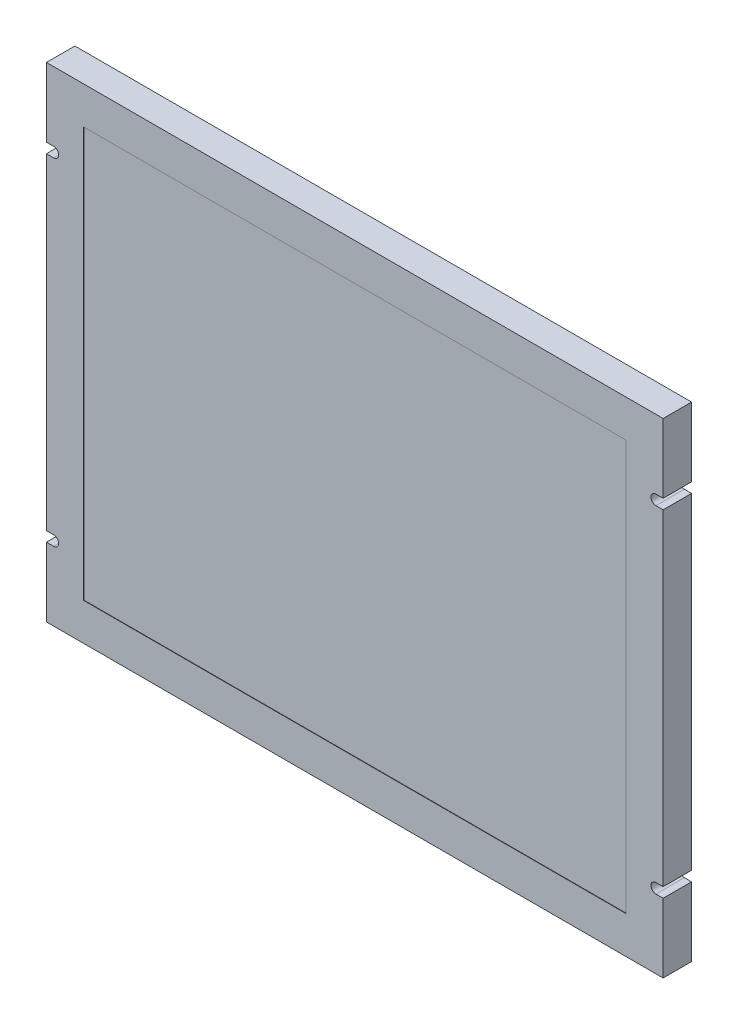
ISO-10303-21;
HEADER;
FILE_DESCRIPTION(('STEP AP214'),'2;1');
FILE_NAME('part.step','',(''),(''),'','','');
FILE_SCHEMA(('AUTOMOTIVE_DESIGN { 1 0 10303 214 1 1 1 1 }'));
ENDSEC;
DATA;
#1=APPLICATION_CONTEXT('core data for automotive mechanical design processes');
#2=APPLICATION_PROTOCOL_DEFINITION('international standard','automotive_design',2000,#1);
#3=PRODUCT_CONTEXT('',#1,'mechanical');
#4=PRODUCT('Part','Part','',(#3));
#5=PRODUCT_RELATED_PRODUCT_CATEGORY('part','',(#4));
#6=PRODUCT_DEFINITION_FORMATION('','',#4);
#7=PRODUCT_DEFINITION_CONTEXT('part definition',#1,'design');
#8=PRODUCT_DEFINITION('design','',#6,#7);
#9=PRODUCT_DEFINITION_SHAPE('','',#8);
#10=(LENGTH_UNIT() NAMED_UNIT(*) SI_UNIT(.MILLI.,.METRE.));
#11=(NAMED_UNIT(*) PLANE_ANGLE_UNIT() SI_UNIT($,.RADIAN.));
#12=(NAMED_UNIT(*) SI_UNIT($,.STERADIAN.) SOLID_ANGLE_UNIT());
#13=UNCERTAINTY_MEASURE_WITH_UNIT(LENGTH_MEASURE(1.E-05),#10,'distance_accuracy_value','');
#14=(GEOMETRIC_REPRESENTATION_CONTEXT(3) GLOBAL_UNCERTAINTY_ASSIGNED_CONTEXT((#13)) GLOBAL_UNIT_ASSIGNED_CONTEXT((#10,
#11,#12)) REPRESENTATION_CONTEXT('',''));
#15=CARTESIAN_POINT('',(0.,0.,0.));
#16=DIRECTION('',(0.,0.,1.));
#17=DIRECTION('',(1.,0.,0.));
#18=AXIS2_PLACEMENT_3D('',#15,#16,#17);
#19=CARTESIAN_POINT('',(0.,0.,7.1));
#20=DIRECTION('',(1.,0.,0.));
#21=DIRECTION('',(0.,1.,0.));
#22=AXIS2_PLACEMENT_3D('',#19,#20,#21);
#23=PLANE('',#22);
#24=DIRECTION('',(0.,-1.,0.));
#25=VECTOR('',#24,1.);
#26=CARTESIAN_POINT('',(0.,0.,7.1));
#27=LINE('',#26,#25);
#28=CARTESIAN_POINT('',(0.,-103.75,7.1));
#29=VERTEX_POINT('',#28);
#30=CARTESIAN_POINT('',(0.,-121.,7.1));
#31=VERTEX_POINT('',#30);
#32=EDGE_CURVE('E314',#29,#31,#27,.T.);
#33=ORIENTED_EDGE('',*,*,#32,.F.);
#34=DIRECTION('',(0.,0.,1.));
#35=VECTOR('',#34,1.);
#36=CARTESIAN_POINT('',(0.,-103.75,-2.9));
#37=LINE('',#36,#35);
#38=CARTESIAN_POINT('',(0.,-103.75,0.));
#39=VERTEX_POINT('',#38);
#40=EDGE_CURVE('E216',#39,#29,#37,.T.);
#41=ORIENTED_EDGE('',*,*,#40,.F.);
#42=DIRECTION('',(0.,-1.,0.));
#43=VECTOR('',#42,1.);
#44=CARTESIAN_POINT('',(0.,0.,0.));
#45=LINE('',#44,#43);
#46=CARTESIAN_POINT('',(0.,-121.,0.));
#47=VERTEX_POINT('',#46);
#48=EDGE_CURVE('E294',#39,#47,#45,.T.);
#49=ORIENTED_EDGE('',*,*,#48,.T.);
#50=DIRECTION('',(0.,0.,-1.));
#51=VECTOR('',#50,1.);
#52=CARTESIAN_POINT('',(0.,-121.,7.1));
#53=LINE('',#52,#51);
#54=EDGE_CURVE('E336',#31,#47,#53,.T.);
#55=ORIENTED_EDGE('',*,*,#54,.F.);
#56=EDGE_LOOP('',(#33,#41,#49,#55));
#57=FACE_BOUND('',#56,.T.);
#58=ADVANCED_FACE('F27',(#57),#23,.F.);
#59=CARTESIAN_POINT('',(154.,0.,7.1));
#60=DIRECTION('',(-1.,0.,0.));
#61=DIRECTION('',(0.,-1.,0.));
#62=AXIS2_PLACEMENT_3D('',#59,#60,#61);
#63=PLANE('',#62);
#64=DIRECTION('',(0.,1.,0.));
#65=VECTOR('',#64,1.);
#66=CARTESIAN_POINT('',(154.,0.,0.));
#67=LINE('',#66,#65);
#68=CARTESIAN_POINT('',(154.,-121.,0.));
#69=VERTEX_POINT('',#68);
#70=CARTESIAN_POINT('',(154.,-103.75,0.));
#71=VERTEX_POINT('',#70);
#72=EDGE_CURVE('E308',#69,#71,#67,.T.);
#73=ORIENTED_EDGE('',*,*,#72,.T.);
#74=DIRECTION('',(0.,0.,1.));
#75=VECTOR('',#74,1.);
#76=CARTESIAN_POINT('',(154.,-103.75,-2.9));
#77=LINE('',#76,#75);
#78=CARTESIAN_POINT('',(154.,-103.75,7.1));
#79=VERTEX_POINT('',#78);
#80=EDGE_CURVE('E226',#71,#79,#77,.T.);
#81=ORIENTED_EDGE('',*,*,#80,.T.);
#82=DIRECTION('',(0.,1.,0.));
#83=VECTOR('',#82,1.);
#84=CARTESIAN_POINT('',(154.,0.,7.1));
#85=LINE('',#84,#83);
#86=CARTESIAN_POINT('',(154.,-121.,7.1));
#87=VERTEX_POINT('',#86);
#88=EDGE_CURVE('E321',#87,#79,#85,.T.);
#89=ORIENTED_EDGE('',*,*,#88,.F.);
#90=DIRECTION('',(0.,0.,-1.));
#91=VECTOR('',#90,1.);
#92=CARTESIAN_POINT('',(154.,-121.,7.1));
#93=LINE('',#92,#91);
#94=EDGE_CURVE('E333',#87,#69,#93,.T.);
#95=ORIENTED_EDGE('',*,*,#94,.T.);
#96=EDGE_LOOP('',(#73,#81,#89,#95));
#97=FACE_BOUND('',#96,.T.);
#98=ADVANCED_FACE('F386',(#97),#63,.F.);
#99=CARTESIAN_POINT('',(0.,-19.7499999999999,0.));
#100=VERTEX_POINT('',#99);
#101=CARTESIAN_POINT('',(0.,-101.25,0.));
#102=VERTEX_POINT('',#101);
#103=EDGE_CURVE('E305',#100,#102,#45,.T.);
#104=ORIENTED_EDGE('',*,*,#103,.T.);
#105=DIRECTION('',(0.,0.,1.));
#106=VECTOR('',#105,1.);
#107=CARTESIAN_POINT('',(0.,-101.25,-2.9));
#108=LINE('',#107,#106);
#109=CARTESIAN_POINT('',(0.,-101.25,7.1));
#110=VERTEX_POINT('',#109);
#111=EDGE_CURVE('E42',#102,#110,#108,.T.);
#112=ORIENTED_EDGE('',*,*,#111,.T.);
#113=CARTESIAN_POINT('',(0.,-19.7499999999999,7.1));
#114=VERTEX_POINT('',#113);
#115=EDGE_CURVE('E210',#114,#110,#27,.T.);
#116=ORIENTED_EDGE('',*,*,#115,.F.);
#117=DIRECTION('',(0.,0.,1.));
#118=VECTOR('',#117,1.);
#119=CARTESIAN_POINT('',(0.,-19.7499999999999,-2.9));
#120=LINE('',#119,#118);
#121=EDGE_CURVE('E245',#100,#114,#120,.T.);
#122=ORIENTED_EDGE('',*,*,#121,.F.);
#123=EDGE_LOOP('',(#104,#112,#116,#122));
#124=FACE_BOUND('',#123,.T.);
#125=ADVANCED_FACE('F429',(#124),#23,.F.);
#126=CARTESIAN_POINT('',(154.,-101.25,7.1));
#127=VERTEX_POINT('',#126);
#128=CARTESIAN_POINT('',(154.,-19.75,7.1));
#129=VERTEX_POINT('',#128);
#130=EDGE_CURVE('E325',#127,#129,#85,.T.);
#131=ORIENTED_EDGE('',*,*,#130,.F.);
#132=DIRECTION('',(0.,0.,1.));
#133=VECTOR('',#132,1.);
#134=CARTESIAN_POINT('',(154.,-101.25,-2.9));
#135=LINE('',#134,#133);
#136=CARTESIAN_POINT('',(154.,-101.25,0.));
#137=VERTEX_POINT('',#136);
#138=EDGE_CURVE('E225',#137,#127,#135,.T.);
#139=ORIENTED_EDGE('',*,*,#138,.F.);
#140=CARTESIAN_POINT('',(154.,-19.75,0.));
#141=VERTEX_POINT('',#140);
#142=EDGE_CURVE('E312',#137,#141,#67,.T.);
#143=ORIENTED_EDGE('',*,*,#142,.T.);
#144=DIRECTION('',(0.,0.,1.));
#145=VECTOR('',#144,1.);
#146=CARTESIAN_POINT('',(154.,-19.75,-2.9));
#147=LINE('',#146,#145);
#148=EDGE_CURVE('E260',#141,#129,#147,.T.);
#149=ORIENTED_EDGE('',*,*,#148,.T.);
#150=EDGE_LOOP('',(#131,#139,#143,#149));
#151=FACE_BOUND('',#150,.T.);
#152=ADVANCED_FACE('F399',(#151),#63,.F.);
#153=CARTESIAN_POINT('',(0.,0.,0.));
#154=VERTEX_POINT('',#153);
#155=CARTESIAN_POINT('',(0.,-17.25,0.));
#156=VERTEX_POINT('',#155);
#157=EDGE_CURVE('E301',#154,#156,#45,.T.);
#158=ORIENTED_EDGE('',*,*,#157,.T.);
#159=DIRECTION('',(0.,0.,1.));
#160=VECTOR('',#159,1.);
#161=CARTESIAN_POINT('',(0.,-17.25,-2.9));
#162=LINE('',#161,#160);
#163=CARTESIAN_POINT('',(0.,-17.25,7.1));
#164=VERTEX_POINT('',#163);
#165=EDGE_CURVE('E247',#156,#164,#162,.T.);
#166=ORIENTED_EDGE('',*,*,#165,.T.);
#167=CARTESIAN_POINT('',(0.,0.,7.1));
#168=VERTEX_POINT('',#167);
#169=EDGE_CURVE('E315',#168,#164,#27,.T.);
#170=ORIENTED_EDGE('',*,*,#169,.F.);
#171=DIRECTION('',(0.,0.,-1.));
#172=VECTOR('',#171,1.);
#173=CARTESIAN_POINT('',(0.,0.,7.1));
#174=LINE('',#173,#172);
#175=EDGE_CURVE('E327',#168,#154,#174,.T.);
#176=ORIENTED_EDGE('',*,*,#175,.T.);
#177=EDGE_LOOP('',(#158,#166,#170,#176));
#178=FACE_BOUND('',#177,.T.);
#179=ADVANCED_FACE('F29',(#178),#23,.F.);
#180=CARTESIAN_POINT('',(0.,-121.,7.1));
#181=DIRECTION('',(0.,1.,0.));
#182=DIRECTION('',(0.,0.,1.));
#183=AXIS2_PLACEMENT_3D('',#180,#181,#182);
#184=PLANE('',#183);
#185=DIRECTION('',(1.,0.,0.));
#186=VECTOR('',#185,1.);
#187=CARTESIAN_POINT('',(0.,-121.,0.));
#188=LINE('',#187,#186);
#189=EDGE_CURVE('E304',#47,#69,#188,.T.);
#190=ORIENTED_EDGE('',*,*,#189,.T.);
#191=ORIENTED_EDGE('',*,*,#94,.F.);
#192=DIRECTION('',(1.,0.,0.));
#193=VECTOR('',#192,1.);
#194=CARTESIAN_POINT('',(0.,-121.,7.1));
#195=LINE('',#194,#193);
#196=EDGE_CURVE('E318',#31,#87,#195,.T.);
#197=ORIENTED_EDGE('',*,*,#196,.F.);
#198=ORIENTED_EDGE('',*,*,#54,.T.);
#199=EDGE_LOOP('',(#190,#191,#197,#198));
#200=FACE_BOUND('',#199,.T.);
#201=ADVANCED_FACE('F380',(#200),#184,.F.);
#202=CARTESIAN_POINT('',(154.,-17.25,7.1));
#203=VERTEX_POINT('',#202);
#204=CARTESIAN_POINT('',(154.,0.,7.1));
#205=VERTEX_POINT('',#204);
#206=EDGE_CURVE('E320',#203,#205,#85,.T.);
#207=ORIENTED_EDGE('',*,*,#206,.F.);
#208=DIRECTION('',(0.,0.,1.));
#209=VECTOR('',#208,1.);
#210=CARTESIAN_POINT('',(154.,-17.25,-2.9));
#211=LINE('',#210,#209);
#212=CARTESIAN_POINT('',(154.,-17.25,0.));
#213=VERTEX_POINT('',#212);
#214=EDGE_CURVE('E259',#213,#203,#211,.T.);
#215=ORIENTED_EDGE('',*,*,#214,.F.);
#216=CARTESIAN_POINT('',(154.,0.,0.));
#217=VERTEX_POINT('',#216);
#218=EDGE_CURVE('E307',#213,#217,#67,.T.);
#219=ORIENTED_EDGE('',*,*,#218,.T.);
#220=DIRECTION('',(0.,0.,-1.));
#221=VECTOR('',#220,1.);
#222=CARTESIAN_POINT('',(154.,0.,7.1));
#223=LINE('',#222,#221);
#224=EDGE_CURVE('E330',#205,#217,#223,.T.);
#225=ORIENTED_EDGE('',*,*,#224,.F.);
#226=EDGE_LOOP('',(#207,#215,#219,#225));
#227=FACE_BOUND('',#226,.T.);
#228=ADVANCED_FACE('F409',(#227),#63,.F.);
#229=CARTESIAN_POINT('',(0.,0.,7.1));
#230=DIRECTION('',(0.,-1.,0.));
#231=DIRECTION('',(0.,0.,-1.));
#232=AXIS2_PLACEMENT_3D('',#229,#230,#231);
#233=PLANE('',#232);
#234=DIRECTION('',(-1.,0.,0.));
#235=VECTOR('',#234,1.);
#236=CARTESIAN_POINT('',(0.,0.,0.));
#237=LINE('',#236,#235);
#238=EDGE_CURVE('E311',#217,#154,#237,.T.);
#239=ORIENTED_EDGE('',*,*,#238,.T.);
#240=ORIENTED_EDGE('',*,*,#175,.F.);
#241=DIRECTION('',(-1.,0.,0.));
#242=VECTOR('',#241,1.);
#243=CARTESIAN_POINT('',(0.,0.,7.1));
#244=LINE('',#243,#242);
#245=EDGE_CURVE('E324',#205,#168,#244,.T.);
#246=ORIENTED_EDGE('',*,*,#245,.F.);
#247=ORIENTED_EDGE('',*,*,#224,.T.);
#248=EDGE_LOOP('',(#239,#240,#246,#247));
#249=FACE_BOUND('',#248,.T.);
#250=ADVANCED_FACE('F413',(#249),#233,.F.);
#251=CARTESIAN_POINT('',(0.,-121.,7.1));
#252=DIRECTION('',(0.,0.,1.));
#253=DIRECTION('',(1.,0.,0.));
#254=AXIS2_PLACEMENT_3D('',#251,#252,#253);
#255=PLANE('',#254);
#256=DIRECTION('',(1.,0.,0.));
#257=VECTOR('',#256,1.);
#258=CARTESIAN_POINT('',(1.80000000000002,-103.75,7.1));
#259=LINE('',#258,#257);
#260=CARTESIAN_POINT('',(1.80000000000002,-103.75,7.1));
#261=VERTEX_POINT('',#260);
#262=EDGE_CURVE('E194',#29,#261,#259,.T.);
#263=ORIENTED_EDGE('',*,*,#262,.F.);
#264=ORIENTED_EDGE('',*,*,#32,.T.);
#265=ORIENTED_EDGE('',*,*,#196,.T.);
#266=ORIENTED_EDGE('',*,*,#88,.T.);
#267=DIRECTION('',(1.,0.,0.));
#268=VECTOR('',#267,1.);
#269=CARTESIAN_POINT('',(154.,-103.75,7.1));
#270=LINE('',#269,#268);
#271=CARTESIAN_POINT('',(152.2,-103.75,7.1));
#272=VERTEX_POINT('',#271);
#273=EDGE_CURVE('E223',#272,#79,#270,.T.);
#274=ORIENTED_EDGE('',*,*,#273,.F.);
#275=CARTESIAN_POINT('',(152.2,-102.5,7.1));
#276=DIRECTION('',(0.,0.,1.));
#277=DIRECTION('',(-1.,0.,0.));
#278=AXIS2_PLACEMENT_3D('',#275,#276,#277);
#279=CIRCLE('',#278,1.25);
#280=CARTESIAN_POINT('',(152.2,-101.25,7.1));
#281=VERTEX_POINT('',#280);
#282=EDGE_CURVE('E220',#281,#272,#279,.T.);
#283=ORIENTED_EDGE('',*,*,#282,.F.);
#284=DIRECTION('',(-1.,0.,0.));
#285=VECTOR('',#284,1.);
#286=CARTESIAN_POINT('',(154.,-101.25,7.1));
#287=LINE('',#286,#285);
#288=EDGE_CURVE('E215',#127,#281,#287,.T.);
#289=ORIENTED_EDGE('',*,*,#288,.F.);
#290=ORIENTED_EDGE('',*,*,#130,.T.);
#291=DIRECTION('',(1.,0.,0.));
#292=VECTOR('',#291,1.);
#293=CARTESIAN_POINT('',(154.,-19.75,7.1));
#294=LINE('',#293,#292);
#295=CARTESIAN_POINT('',(152.2,-19.7499999999999,7.1));
#296=VERTEX_POINT('',#295);
#297=EDGE_CURVE('E256',#296,#129,#294,.T.);
#298=ORIENTED_EDGE('',*,*,#297,.F.);
#299=CARTESIAN_POINT('',(152.2,-18.5,7.1));
#300=DIRECTION('',(0.,0.,1.));
#301=DIRECTION('',(-1.,0.,0.));
#302=AXIS2_PLACEMENT_3D('',#299,#300,#301);
#303=CIRCLE('',#302,1.25);
#304=CARTESIAN_POINT('',(152.2,-17.25,7.1));
#305=VERTEX_POINT('',#304);
#306=EDGE_CURVE('E253',#305,#296,#303,.T.);
#307=ORIENTED_EDGE('',*,*,#306,.F.);
#308=DIRECTION('',(-1.,0.,0.));
#309=VECTOR('',#308,1.);
#310=CARTESIAN_POINT('',(154.,-17.25,7.1));
#311=LINE('',#310,#309);
#312=EDGE_CURVE('E244',#203,#305,#311,.T.);
#313=ORIENTED_EDGE('',*,*,#312,.F.);
#314=ORIENTED_EDGE('',*,*,#206,.T.);
#315=ORIENTED_EDGE('',*,*,#245,.T.);
#316=ORIENTED_EDGE('',*,*,#169,.T.);
#317=DIRECTION('',(-1.,0.,0.));
#318=VECTOR('',#317,1.);
#319=CARTESIAN_POINT('',(1.80000000000002,-17.25,7.1));
#320=LINE('',#319,#318);
#321=CARTESIAN_POINT('',(1.80000000000002,-17.25,7.1));
#322=VERTEX_POINT('',#321);
#323=EDGE_CURVE('E236',#322,#164,#320,.T.);
#324=ORIENTED_EDGE('',*,*,#323,.F.);
#325=CARTESIAN_POINT('',(1.80000000000002,-18.5,7.1));
#326=DIRECTION('',(0.,0.,1.));
#327=DIRECTION('',(-1.,0.,0.));
#328=AXIS2_PLACEMENT_3D('',#325,#326,#327);
#329=CIRCLE('',#328,1.25);
#330=CARTESIAN_POINT('',(1.80000000000002,-19.75,7.1));
#331=VERTEX_POINT('',#330);
#332=EDGE_CURVE('E229',#331,#322,#329,.T.);
#333=ORIENTED_EDGE('',*,*,#332,.F.);
#334=DIRECTION('',(1.,0.,0.));
#335=VECTOR('',#334,1.);
#336=CARTESIAN_POINT('',(1.80000000000002,-19.75,7.1));
#337=LINE('',#336,#335);
#338=EDGE_CURVE('E238',#114,#331,#337,.T.);
#339=ORIENTED_EDGE('',*,*,#338,.F.);
#340=ORIENTED_EDGE('',*,*,#115,.T.);
#341=DIRECTION('',(-1.,0.,0.));
#342=VECTOR('',#341,1.);
#343=CARTESIAN_POINT('',(1.80000000000002,-101.25,7.1));
#344=LINE('',#343,#342);
#345=CARTESIAN_POINT('',(1.80000000000002,-101.25,7.1));
#346=VERTEX_POINT('',#345);
#347=EDGE_CURVE('E190',#346,#110,#344,.T.);
#348=ORIENTED_EDGE('',*,*,#347,.F.);
#349=CARTESIAN_POINT('',(1.80000000000002,-102.5,7.1));
#350=DIRECTION('',(0.,0.,1.));
#351=DIRECTION('',(-1.,0.,0.));
#352=AXIS2_PLACEMENT_3D('',#349,#350,#351);
#353=CIRCLE('',#352,1.25);
#354=EDGE_CURVE('E197',#261,#346,#353,.T.);
#355=ORIENTED_EDGE('',*,*,#354,.F.);
#356=EDGE_LOOP('',(#263,#264,#265,#266,#274,#283,#289,#290,#298,#307,#313,#314,#315,#316,#324,
#333,#339,#340,#348,#355));
#357=FACE_BOUND('',#356,.T.);
#358=DIRECTION('',(0.,-1.,0.));
#359=VECTOR('',#358,1.);
#360=CARTESIAN_POINT('',(9.25000000000001,-9.3,7.1));
#361=LINE('',#360,#359);
#362=CARTESIAN_POINT('',(9.25000000000001,-9.3,7.1));
#363=VERTEX_POINT('',#362);
#364=CARTESIAN_POINT('',(9.25000000000002,-111.7,7.1));
#365=VERTEX_POINT('',#364);
#366=EDGE_CURVE('E263',#363,#365,#361,.T.);
#367=ORIENTED_EDGE('',*,*,#366,.F.);
#368=DIRECTION('',(-1.,0.,0.));
#369=VECTOR('',#368,1.);
#370=CARTESIAN_POINT('',(9.25000000000001,-9.3,7.1));
#371=LINE('',#370,#369);
#372=CARTESIAN_POINT('',(144.75,-9.3,7.1));
#373=VERTEX_POINT('',#372);
#374=EDGE_CURVE('E276',#373,#363,#371,.T.);
#375=ORIENTED_EDGE('',*,*,#374,.F.);
#376=DIRECTION('',(0.,1.,0.));
#377=VECTOR('',#376,1.);
#378=CARTESIAN_POINT('',(144.75,-9.3,7.1));
#379=LINE('',#378,#377);
#380=CARTESIAN_POINT('',(144.75,-111.7,7.1));
#381=VERTEX_POINT('',#380);
#382=EDGE_CURVE('E273',#381,#373,#379,.T.);
#383=ORIENTED_EDGE('',*,*,#382,.F.);
#384=DIRECTION('',(1.,0.,0.));
#385=VECTOR('',#384,1.);
#386=CARTESIAN_POINT('',(9.25000000000002,-111.7,7.1));
#387=LINE('',#386,#385);
#388=EDGE_CURVE('E270',#365,#381,#387,.T.);
#389=ORIENTED_EDGE('',*,*,#388,.F.);
#390=EDGE_LOOP('',(#367,#375,#383,#389));
#391=FACE_BOUND('',#390,.T.);
#392=ADVANCED_FACE('F206',(#357,#391),#255,.T.);
#393=CARTESIAN_POINT('',(0.,-121.,0.));
#394=DIRECTION('',(0.,0.,1.));
#395=DIRECTION('',(1.,0.,0.));
#396=AXIS2_PLACEMENT_3D('',#393,#394,#395);
#397=PLANE('',#396);
#398=ORIENTED_EDGE('',*,*,#48,.F.);
#399=DIRECTION('',(1.,0.,0.));
#400=VECTOR('',#399,1.);
#401=CARTESIAN_POINT('',(0.,-103.75,0.));
#402=LINE('',#401,#400);
#403=CARTESIAN_POINT('',(1.80000000000002,-103.75,0.));
#404=VERTEX_POINT('',#403);
#405=EDGE_CURVE('E11',#39,#404,#402,.T.);
#406=ORIENTED_EDGE('',*,*,#405,.T.);
#407=CARTESIAN_POINT('',(1.80000000000002,-102.5,0.));
#408=DIRECTION('',(0.,0.,1.));
#409=DIRECTION('',(1.,0.,0.));
#410=AXIS2_PLACEMENT_3D('',#407,#408,#409);
#411=CIRCLE('',#410,1.25);
#412=CARTESIAN_POINT('',(1.80000000000002,-101.25,0.));
#413=VERTEX_POINT('',#412);
#414=EDGE_CURVE('E35',#404,#413,#411,.T.);
#415=ORIENTED_EDGE('',*,*,#414,.T.);
#416=DIRECTION('',(-1.,0.,0.));
#417=VECTOR('',#416,1.);
#418=CARTESIAN_POINT('',(0.,-101.25,0.));
#419=LINE('',#418,#417);
#420=EDGE_CURVE('E191',#413,#102,#419,.T.);
#421=ORIENTED_EDGE('',*,*,#420,.T.);
#422=ORIENTED_EDGE('',*,*,#103,.F.);
#423=DIRECTION('',(1.,0.,0.));
#424=VECTOR('',#423,1.);
#425=CARTESIAN_POINT('',(4.05130518976033E-13,-19.75,0.));
#426=LINE('',#425,#424);
#427=CARTESIAN_POINT('',(1.80000000000002,-19.75,0.));
#428=VERTEX_POINT('',#427);
#429=EDGE_CURVE('E354',#100,#428,#426,.T.);
#430=ORIENTED_EDGE('',*,*,#429,.T.);
#431=CARTESIAN_POINT('',(1.80000000000002,-18.5,0.));
#432=DIRECTION('',(0.,0.,1.));
#433=DIRECTION('',(1.,0.,0.));
#434=AXIS2_PLACEMENT_3D('',#431,#432,#433);
#435=CIRCLE('',#434,1.25);
#436=CARTESIAN_POINT('',(1.80000000000002,-17.25,0.));
#437=VERTEX_POINT('',#436);
#438=EDGE_CURVE('E351',#428,#437,#435,.T.);
#439=ORIENTED_EDGE('',*,*,#438,.T.);
#440=DIRECTION('',(-1.,0.,0.));
#441=VECTOR('',#440,1.);
#442=CARTESIAN_POINT('',(-1.85157330488298E-13,-17.25,0.));
#443=LINE('',#442,#441);
#444=EDGE_CURVE('E348',#437,#156,#443,.T.);
#445=ORIENTED_EDGE('',*,*,#444,.T.);
#446=ORIENTED_EDGE('',*,*,#157,.F.);
#447=ORIENTED_EDGE('',*,*,#238,.F.);
#448=ORIENTED_EDGE('',*,*,#218,.F.);
#449=DIRECTION('',(-1.,0.,0.));
#450=VECTOR('',#449,1.);
#451=CARTESIAN_POINT('',(-1.85157330488298E-13,-17.2500000000003,0.));
#452=LINE('',#451,#450);
#453=CARTESIAN_POINT('',(152.2,-17.25,0.));
#454=VERTEX_POINT('',#453);
#455=EDGE_CURVE('E339',#213,#454,#452,.T.);
#456=ORIENTED_EDGE('',*,*,#455,.T.);
#457=CARTESIAN_POINT('',(152.2,-18.5,0.));
#458=DIRECTION('',(0.,0.,1.));
#459=DIRECTION('',(1.,0.,0.));
#460=AXIS2_PLACEMENT_3D('',#457,#458,#459);
#461=CIRCLE('',#460,1.25);
#462=CARTESIAN_POINT('',(152.2,-19.7499999999999,0.));
#463=VERTEX_POINT('',#462);
#464=EDGE_CURVE('E342',#454,#463,#461,.T.);
#465=ORIENTED_EDGE('',*,*,#464,.T.);
#466=DIRECTION('',(1.,0.,0.));
#467=VECTOR('',#466,1.);
#468=CARTESIAN_POINT('',(4.05130518976035E-13,-19.7499999999994,0.));
#469=LINE('',#468,#467);
#470=EDGE_CURVE('E345',#463,#141,#469,.T.);
#471=ORIENTED_EDGE('',*,*,#470,.T.);
#472=ORIENTED_EDGE('',*,*,#142,.F.);
#473=DIRECTION('',(-1.,0.,0.));
#474=VECTOR('',#473,1.);
#475=CARTESIAN_POINT('',(0.,-101.25,0.));
#476=LINE('',#475,#474);
#477=CARTESIAN_POINT('',(152.2,-101.25,0.));
#478=VERTEX_POINT('',#477);
#479=EDGE_CURVE('E357',#137,#478,#476,.T.);
#480=ORIENTED_EDGE('',*,*,#479,.T.);
#481=CARTESIAN_POINT('',(152.2,-102.5,0.));
#482=DIRECTION('',(0.,0.,1.));
#483=DIRECTION('',(1.,0.,0.));
#484=AXIS2_PLACEMENT_3D('',#481,#482,#483);
#485=CIRCLE('',#484,1.25);
#486=CARTESIAN_POINT('',(152.2,-103.75,0.));
#487=VERTEX_POINT('',#486);
#488=EDGE_CURVE('E360',#478,#487,#485,.T.);
#489=ORIENTED_EDGE('',*,*,#488,.T.);
#490=DIRECTION('',(1.,0.,0.));
#491=VECTOR('',#490,1.);
#492=CARTESIAN_POINT('',(0.,-103.749999999999,0.));
#493=LINE('',#492,#491);
#494=EDGE_CURVE('E363',#487,#71,#493,.T.);
#495=ORIENTED_EDGE('',*,*,#494,.T.);
#496=ORIENTED_EDGE('',*,*,#72,.F.);
#497=ORIENTED_EDGE('',*,*,#189,.F.);
#498=EDGE_LOOP('',(#398,#406,#415,#421,#422,#430,#439,#445,#446,#447,#448,#456,#465,#471,#472,
#480,#489,#495,#496,#497));
#499=FACE_BOUND('',#498,.T.);
#500=ADVANCED_FACE('F368',(#499),#397,.F.);
#501=CARTESIAN_POINT('',(9.25000000000001,-9.3,7.));
#502=DIRECTION('',(-1.,0.,0.));
#503=DIRECTION('',(0.,-1.,0.));
#504=AXIS2_PLACEMENT_3D('',#501,#502,#503);
#505=PLANE('',#504);
#506=ORIENTED_EDGE('',*,*,#366,.T.);
#507=DIRECTION('',(0.,0.,1.));
#508=VECTOR('',#507,1.);
#509=CARTESIAN_POINT('',(9.25000000000002,-111.7,7.));
#510=LINE('',#509,#508);
#511=CARTESIAN_POINT('',(9.25000000000002,-111.7,7.));
#512=VERTEX_POINT('',#511);
#513=EDGE_CURVE('E291',#512,#365,#510,.T.);
#514=ORIENTED_EDGE('',*,*,#513,.F.);
#515=DIRECTION('',(0.,-1.,0.));
#516=VECTOR('',#515,1.);
#517=CARTESIAN_POINT('',(9.25000000000001,-9.3,7.));
#518=LINE('',#517,#516);
#519=CARTESIAN_POINT('',(9.25000000000001,-9.3,7.));
#520=VERTEX_POINT('',#519);
#521=EDGE_CURVE('E279',#520,#512,#518,.T.);
#522=ORIENTED_EDGE('',*,*,#521,.F.);
#523=DIRECTION('',(0.,0.,1.));
#524=VECTOR('',#523,1.);
#525=CARTESIAN_POINT('',(9.25000000000001,-9.3,7.));
#526=LINE('',#525,#524);
#527=EDGE_CURVE('E292',#520,#363,#526,.T.);
#528=ORIENTED_EDGE('',*,*,#527,.T.);
#529=EDGE_LOOP('',(#506,#514,#522,#528));
#530=FACE_BOUND('',#529,.T.);
#531=ADVANCED_FACE('F475',(#530),#505,.F.);
#532=CARTESIAN_POINT('',(9.25000000000001,-9.3,7.));
#533=DIRECTION('',(0.,1.,0.));
#534=DIRECTION('',(0.,0.,1.));
#535=AXIS2_PLACEMENT_3D('',#532,#533,#534);
#536=PLANE('',#535);
#537=ORIENTED_EDGE('',*,*,#374,.T.);
#538=ORIENTED_EDGE('',*,*,#527,.F.);
#539=DIRECTION('',(-1.,0.,0.));
#540=VECTOR('',#539,1.);
#541=CARTESIAN_POINT('',(9.25000000000001,-9.3,7.));
#542=LINE('',#541,#540);
#543=CARTESIAN_POINT('',(144.75,-9.3,7.));
#544=VERTEX_POINT('',#543);
#545=EDGE_CURVE('E288',#544,#520,#542,.T.);
#546=ORIENTED_EDGE('',*,*,#545,.F.);
#547=DIRECTION('',(0.,0.,1.));
#548=VECTOR('',#547,1.);
#549=CARTESIAN_POINT('',(144.75,-9.3,7.));
#550=LINE('',#549,#548);
#551=EDGE_CURVE('E295',#544,#373,#550,.T.);
#552=ORIENTED_EDGE('',*,*,#551,.T.);
#553=EDGE_LOOP('',(#537,#538,#546,#552));
#554=FACE_BOUND('',#553,.T.);
#555=ADVANCED_FACE('F477',(#554),#536,.F.);
#556=CARTESIAN_POINT('',(144.75,-9.3,7.));
#557=DIRECTION('',(1.,0.,0.));
#558=DIRECTION('',(0.,0.,-1.));
#559=AXIS2_PLACEMENT_3D('',#556,#557,#558);
#560=PLANE('',#559);
#561=ORIENTED_EDGE('',*,*,#382,.T.);
#562=ORIENTED_EDGE('',*,*,#551,.F.);
#563=DIRECTION('',(0.,1.,0.));
#564=VECTOR('',#563,1.);
#565=CARTESIAN_POINT('',(144.75,-9.3,7.));
#566=LINE('',#565,#564);
#567=CARTESIAN_POINT('',(144.75,-111.7,7.));
#568=VERTEX_POINT('',#567);
#569=EDGE_CURVE('E285',#568,#544,#566,.T.);
#570=ORIENTED_EDGE('',*,*,#569,.F.);
#571=DIRECTION('',(0.,0.,1.));
#572=VECTOR('',#571,1.);
#573=CARTESIAN_POINT('',(144.75,-111.7,7.));
#574=LINE('',#573,#572);
#575=EDGE_CURVE('E297',#568,#381,#574,.T.);
#576=ORIENTED_EDGE('',*,*,#575,.T.);
#577=EDGE_LOOP('',(#561,#562,#570,#576));
#578=FACE_BOUND('',#577,.T.);
#579=ADVANCED_FACE('F483',(#578),#560,.F.);
#580=CARTESIAN_POINT('',(9.25000000000002,-111.7,7.));
#581=DIRECTION('',(0.,-1.,0.));
#582=DIRECTION('',(0.,0.,-1.));
#583=AXIS2_PLACEMENT_3D('',#580,#581,#582);
#584=PLANE('',#583);
#585=ORIENTED_EDGE('',*,*,#388,.T.);
#586=ORIENTED_EDGE('',*,*,#575,.F.);
#587=DIRECTION('',(1.,0.,0.));
#588=VECTOR('',#587,1.);
#589=CARTESIAN_POINT('',(9.25000000000002,-111.7,7.));
#590=LINE('',#589,#588);
#591=EDGE_CURVE('E282',#512,#568,#590,.T.);
#592=ORIENTED_EDGE('',*,*,#591,.F.);
#593=ORIENTED_EDGE('',*,*,#513,.T.);
#594=EDGE_LOOP('',(#585,#586,#592,#593));
#595=FACE_BOUND('',#594,.T.);
#596=ADVANCED_FACE('F479',(#595),#584,.F.);
#597=CARTESIAN_POINT('',(9.25000000000002,-111.7,7.));
#598=DIRECTION('',(0.,0.,1.));
#599=DIRECTION('',(1.,0.,0.));
#600=AXIS2_PLACEMENT_3D('',#597,#598,#599);
#601=PLANE('',#600);
#602=ORIENTED_EDGE('',*,*,#521,.T.);
#603=ORIENTED_EDGE('',*,*,#591,.T.);
#604=ORIENTED_EDGE('',*,*,#569,.T.);
#605=ORIENTED_EDGE('',*,*,#545,.T.);
#606=EDGE_LOOP('',(#602,#603,#604,#605));
#607=FACE_BOUND('',#606,.T.);
#608=ADVANCED_FACE('F482',(#607),#601,.T.);
#609=CARTESIAN_POINT('',(154.,-19.75,-2.9));
#610=DIRECTION('',(0.,-1.,0.));
#611=DIRECTION('',(1.,0.,0.));
#612=AXIS2_PLACEMENT_3D('',#609,#610,#611);
#613=PLANE('',#612);
#614=DIRECTION('',(0.,0.,1.));
#615=VECTOR('',#614,1.);
#616=CARTESIAN_POINT('',(152.2,-19.7499999999999,-2.9));
#617=LINE('',#616,#615);
#618=EDGE_CURVE('E264',#463,#296,#617,.T.);
#619=ORIENTED_EDGE('',*,*,#618,.T.);
#620=ORIENTED_EDGE('',*,*,#297,.T.);
#621=ORIENTED_EDGE('',*,*,#148,.F.);
#622=ORIENTED_EDGE('',*,*,#470,.F.);
#623=EDGE_LOOP('',(#619,#620,#621,#622));
#624=FACE_BOUND('',#623,.T.);
#625=ADVANCED_FACE('F431',(#624),#613,.F.);
#626=CARTESIAN_POINT('',(152.2,-18.5,-2.9));
#627=DIRECTION('',(0.,0.,1.));
#628=DIRECTION('',(1.,0.,0.));
#629=AXIS2_PLACEMENT_3D('',#626,#627,#628);
#630=CYLINDRICAL_SURFACE('',#629,1.25);
#631=DIRECTION('',(0.,0.,1.));
#632=VECTOR('',#631,1.);
#633=CARTESIAN_POINT('',(152.2,-17.25,-2.9));
#634=LINE('',#633,#632);
#635=EDGE_CURVE('E266',#454,#305,#634,.T.);
#636=ORIENTED_EDGE('',*,*,#635,.T.);
#637=ORIENTED_EDGE('',*,*,#306,.T.);
#638=ORIENTED_EDGE('',*,*,#618,.F.);
#639=ORIENTED_EDGE('',*,*,#464,.F.);
#640=EDGE_LOOP('',(#636,#637,#638,#639));
#641=FACE_BOUND('',#640,.T.);
#642=ADVANCED_FACE('F435',(#641),#630,.F.);
#643=CARTESIAN_POINT('',(154.,-17.25,-2.9));
#644=DIRECTION('',(0.,1.,0.));
#645=DIRECTION('',(-1.,0.,0.));
#646=AXIS2_PLACEMENT_3D('',#643,#644,#645);
#647=PLANE('',#646);
#648=ORIENTED_EDGE('',*,*,#214,.T.);
#649=ORIENTED_EDGE('',*,*,#312,.T.);
#650=ORIENTED_EDGE('',*,*,#635,.F.);
#651=ORIENTED_EDGE('',*,*,#455,.F.);
#652=EDGE_LOOP('',(#648,#649,#650,#651));
#653=FACE_BOUND('',#652,.T.);
#654=ADVANCED_FACE('F437',(#653),#647,.F.);
#655=CARTESIAN_POINT('',(1.80000000000002,-18.5,-2.9));
#656=DIRECTION('',(0.,0.,1.));
#657=DIRECTION('',(1.,0.,0.));
#658=AXIS2_PLACEMENT_3D('',#655,#656,#657);
#659=CYLINDRICAL_SURFACE('',#658,1.25);
#660=DIRECTION('',(0.,0.,1.));
#661=VECTOR('',#660,1.);
#662=CARTESIAN_POINT('',(1.80000000000002,-19.75,-2.9));
#663=LINE('',#662,#661);
#664=EDGE_CURVE('E242',#428,#331,#663,.T.);
#665=ORIENTED_EDGE('',*,*,#664,.T.);
#666=ORIENTED_EDGE('',*,*,#332,.T.);
#667=DIRECTION('',(0.,0.,1.));
#668=VECTOR('',#667,1.);
#669=CARTESIAN_POINT('',(1.80000000000002,-17.25,-2.9));
#670=LINE('',#669,#668);
#671=EDGE_CURVE('E241',#437,#322,#670,.T.);
#672=ORIENTED_EDGE('',*,*,#671,.F.);
#673=ORIENTED_EDGE('',*,*,#438,.F.);
#674=EDGE_LOOP('',(#665,#666,#672,#673));
#675=FACE_BOUND('',#674,.T.);
#676=ADVANCED_FACE('F423',(#675),#659,.F.);
#677=CARTESIAN_POINT('',(1.80000000000002,-19.75,-2.9));
#678=DIRECTION('',(0.,-1.,0.));
#679=DIRECTION('',(1.,0.,0.));
#680=AXIS2_PLACEMENT_3D('',#677,#678,#679);
#681=PLANE('',#680);
#682=ORIENTED_EDGE('',*,*,#121,.T.);
#683=ORIENTED_EDGE('',*,*,#338,.T.);
#684=ORIENTED_EDGE('',*,*,#664,.F.);
#685=ORIENTED_EDGE('',*,*,#429,.F.);
#686=EDGE_LOOP('',(#682,#683,#684,#685));
#687=FACE_BOUND('',#686,.T.);
#688=ADVANCED_FACE('F426',(#687),#681,.F.);
#689=CARTESIAN_POINT('',(1.80000000000002,-17.25,-2.9));
#690=DIRECTION('',(0.,1.,0.));
#691=DIRECTION('',(-1.,0.,0.));
#692=AXIS2_PLACEMENT_3D('',#689,#690,#691);
#693=PLANE('',#692);
#694=ORIENTED_EDGE('',*,*,#671,.T.);
#695=ORIENTED_EDGE('',*,*,#323,.T.);
#696=ORIENTED_EDGE('',*,*,#165,.F.);
#697=ORIENTED_EDGE('',*,*,#444,.F.);
#698=EDGE_LOOP('',(#694,#695,#696,#697));
#699=FACE_BOUND('',#698,.T.);
#700=ADVANCED_FACE('F420',(#699),#693,.F.);
#701=CARTESIAN_POINT('',(154.,-103.75,-2.9));
#702=DIRECTION('',(0.,-1.,0.));
#703=DIRECTION('',(1.,0.,0.));
#704=AXIS2_PLACEMENT_3D('',#701,#702,#703);
#705=PLANE('',#704);
#706=DIRECTION('',(0.,0.,1.));
#707=VECTOR('',#706,1.);
#708=CARTESIAN_POINT('',(152.2,-103.75,-2.9));
#709=LINE('',#708,#707);
#710=EDGE_CURVE('E230',#487,#272,#709,.T.);
#711=ORIENTED_EDGE('',*,*,#710,.T.);
#712=ORIENTED_EDGE('',*,*,#273,.T.);
#713=ORIENTED_EDGE('',*,*,#80,.F.);
#714=ORIENTED_EDGE('',*,*,#494,.F.);
#715=EDGE_LOOP('',(#711,#712,#713,#714));
#716=FACE_BOUND('',#715,.T.);
#717=ADVANCED_FACE('F389',(#716),#705,.F.);
#718=CARTESIAN_POINT('',(152.2,-102.5,-2.9));
#719=DIRECTION('',(0.,0.,1.));
#720=DIRECTION('',(1.,0.,0.));
#721=AXIS2_PLACEMENT_3D('',#718,#719,#720);
#722=CYLINDRICAL_SURFACE('',#721,1.25);
#723=DIRECTION('',(0.,0.,1.));
#724=VECTOR('',#723,1.);
#725=CARTESIAN_POINT('',(152.2,-101.25,-2.9));
#726=LINE('',#725,#724);
#727=EDGE_CURVE('E50',#478,#281,#726,.T.);
#728=ORIENTED_EDGE('',*,*,#727,.T.);
#729=ORIENTED_EDGE('',*,*,#282,.T.);
#730=ORIENTED_EDGE('',*,*,#710,.F.);
#731=ORIENTED_EDGE('',*,*,#488,.F.);
#732=EDGE_LOOP('',(#728,#729,#730,#731));
#733=FACE_BOUND('',#732,.T.);
#734=ADVANCED_FACE('F393',(#733),#722,.F.);
#735=CARTESIAN_POINT('',(154.,-101.25,-2.9));
#736=DIRECTION('',(0.,1.,0.));
#737=DIRECTION('',(-1.,0.,0.));
#738=AXIS2_PLACEMENT_3D('',#735,#736,#737);
#739=PLANE('',#738);
#740=ORIENTED_EDGE('',*,*,#138,.T.);
#741=ORIENTED_EDGE('',*,*,#288,.T.);
#742=ORIENTED_EDGE('',*,*,#727,.F.);
#743=ORIENTED_EDGE('',*,*,#479,.F.);
#744=EDGE_LOOP('',(#740,#741,#742,#743));
#745=FACE_BOUND('',#744,.T.);
#746=ADVANCED_FACE('F509',(#745),#739,.F.);
#747=CARTESIAN_POINT('',(1.80000000000002,-102.5,-2.9));
#748=DIRECTION('',(0.,0.,1.));
#749=DIRECTION('',(1.,0.,0.));
#750=AXIS2_PLACEMENT_3D('',#747,#748,#749);
#751=CYLINDRICAL_SURFACE('',#750,1.25);
#752=DIRECTION('',(0.,0.,1.));
#753=VECTOR('',#752,1.);
#754=CARTESIAN_POINT('',(1.80000000000002,-103.75,-2.9));
#755=LINE('',#754,#753);
#756=EDGE_CURVE('E200',#404,#261,#755,.T.);
#757=ORIENTED_EDGE('',*,*,#756,.T.);
#758=ORIENTED_EDGE('',*,*,#354,.T.);
#759=DIRECTION('',(0.,0.,1.));
#760=VECTOR('',#759,1.);
#761=CARTESIAN_POINT('',(1.80000000000002,-101.25,-2.9));
#762=LINE('',#761,#760);
#763=EDGE_CURVE('E186',#413,#346,#762,.T.);
#764=ORIENTED_EDGE('',*,*,#763,.F.);
#765=ORIENTED_EDGE('',*,*,#414,.F.);
#766=EDGE_LOOP('',(#757,#758,#764,#765));
#767=FACE_BOUND('',#766,.T.);
#768=ADVANCED_FACE('F198',(#767),#751,.F.);
#769=CARTESIAN_POINT('',(1.80000000000002,-103.75,-2.9));
#770=DIRECTION('',(0.,-1.,0.));
#771=DIRECTION('',(1.,0.,0.));
#772=AXIS2_PLACEMENT_3D('',#769,#770,#771);
#773=PLANE('',#772);
#774=ORIENTED_EDGE('',*,*,#40,.T.);
#775=ORIENTED_EDGE('',*,*,#262,.T.);
#776=ORIENTED_EDGE('',*,*,#756,.F.);
#777=ORIENTED_EDGE('',*,*,#405,.F.);
#778=EDGE_LOOP('',(#774,#775,#776,#777));
#779=FACE_BOUND('',#778,.T.);
#780=ADVANCED_FACE('F372',(#779),#773,.F.);
#781=CARTESIAN_POINT('',(1.80000000000002,-101.25,-2.9));
#782=DIRECTION('',(0.,1.,0.));
#783=DIRECTION('',(-1.,0.,0.));
#784=AXIS2_PLACEMENT_3D('',#781,#782,#783);
#785=PLANE('',#784);
#786=ORIENTED_EDGE('',*,*,#763,.T.);
#787=ORIENTED_EDGE('',*,*,#347,.T.);
#788=ORIENTED_EDGE('',*,*,#111,.F.);
#789=ORIENTED_EDGE('',*,*,#420,.F.);
#790=EDGE_LOOP('',(#786,#787,#788,#789));
#791=FACE_BOUND('',#790,.T.);
#792=ADVANCED_FACE('F188',(#791),#785,.F.);
#793=CLOSED_SHELL('',(#58,#98,#125,#152,#179,#201,#228,#250,#392,#500,#531,#555,#579,#596,#608,
#625,#642,#654,#676,#688,#700,#717,#734,#746,#768,#780,#792));
#794=MANIFOLD_SOLID_BREP('B2',#793);
#795=ADVANCED_BREP_SHAPE_REPRESENTATION('',(#18,#794),#14);
#796=SHAPE_DEFINITION_REPRESENTATION(#9,#795);
ENDSEC;
END-ISO-10303-21;
